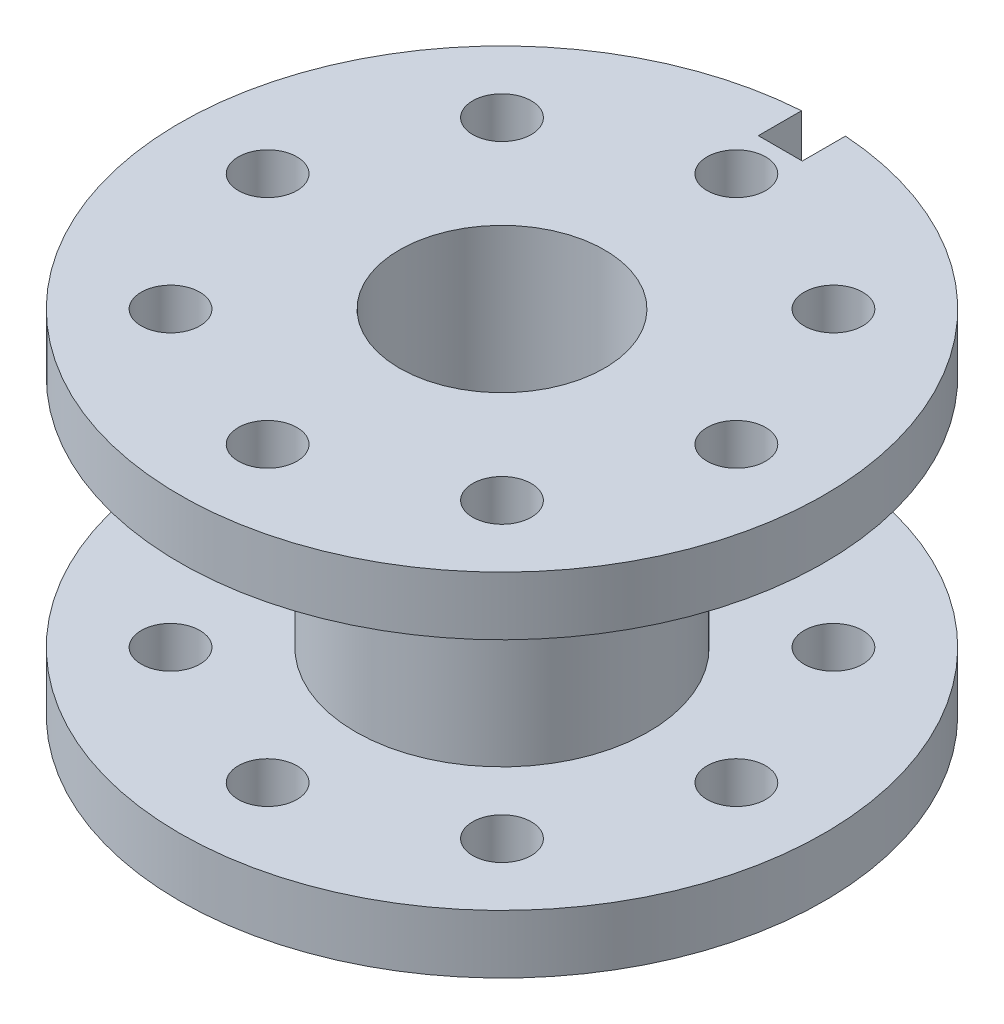
ISO-10303-21;
HEADER;
FILE_DESCRIPTION(('STEP AP214'),'2;1');
FILE_NAME('part.step','',(''),(''),'','','');
FILE_SCHEMA(('AUTOMOTIVE_DESIGN { 1 0 10303 214 1 1 1 1 }'));
ENDSEC;
DATA;
#1=APPLICATION_CONTEXT('core data for automotive mechanical design processes');
#2=APPLICATION_PROTOCOL_DEFINITION('international standard','automotive_design',2000,#1);
#3=PRODUCT_CONTEXT('',#1,'mechanical');
#4=PRODUCT('Part','Part','',(#3));
#5=PRODUCT_RELATED_PRODUCT_CATEGORY('part','',(#4));
#6=PRODUCT_DEFINITION_FORMATION('','',#4);
#7=PRODUCT_DEFINITION_CONTEXT('part definition',#1,'design');
#8=PRODUCT_DEFINITION('design','',#6,#7);
#9=PRODUCT_DEFINITION_SHAPE('','',#8);
#10=(LENGTH_UNIT() NAMED_UNIT(*) SI_UNIT(.MILLI.,.METRE.));
#11=(NAMED_UNIT(*) PLANE_ANGLE_UNIT() SI_UNIT($,.RADIAN.));
#12=(NAMED_UNIT(*) SI_UNIT($,.STERADIAN.) SOLID_ANGLE_UNIT());
#13=UNCERTAINTY_MEASURE_WITH_UNIT(LENGTH_MEASURE(1.E-05),#10,'distance_accuracy_value','');
#14=(GEOMETRIC_REPRESENTATION_CONTEXT(3) GLOBAL_UNCERTAINTY_ASSIGNED_CONTEXT((#13)) GLOBAL_UNIT_ASSIGNED_CONTEXT((#10,
#11,#12)) REPRESENTATION_CONTEXT('',''));
#15=CARTESIAN_POINT('',(0.,0.,0.));
#16=DIRECTION('',(0.,0.,1.));
#17=DIRECTION('',(1.,0.,0.));
#18=AXIS2_PLACEMENT_3D('',#15,#16,#17);
#19=CARTESIAN_POINT('',(0.,12.,0.));
#20=DIRECTION('',(0.,-1.,0.));
#21=DIRECTION('',(0.,0.,-1.));
#22=AXIS2_PLACEMENT_3D('',#19,#20,#21);
#23=CYLINDRICAL_SURFACE('',#22,11.);
#24=CARTESIAN_POINT('',(0.,0.,0.));
#25=DIRECTION('',(0.,1.,0.));
#26=DIRECTION('',(0.,0.,1.));
#27=AXIS2_PLACEMENT_3D('',#24,#25,#26);
#28=CIRCLE('',#27,11.);
#29=CARTESIAN_POINT('',(0.,0.,11.));
#30=VERTEX_POINT('',#29);
#31=EDGE_CURVE('E212',#30,#30,#28,.T.);
#32=ORIENTED_EDGE('',*,*,#31,.T.);
#33=EDGE_LOOP('',(#32));
#34=FACE_BOUND('',#33,.T.);
#35=CARTESIAN_POINT('',(0.,2.,0.));
#36=DIRECTION('',(0.,1.,0.));
#37=DIRECTION('',(0.,0.,1.));
#38=AXIS2_PLACEMENT_3D('',#35,#36,#37);
#39=CIRCLE('',#38,11.);
#40=CARTESIAN_POINT('',(0.,2.,11.));
#41=VERTEX_POINT('',#40);
#42=EDGE_CURVE('E111',#41,#41,#39,.T.);
#43=ORIENTED_EDGE('',*,*,#42,.F.);
#44=EDGE_LOOP('',(#43));
#45=FACE_BOUND('',#44,.T.);
#46=ADVANCED_FACE('F38',(#34,#45),#23,.T.);
#47=CARTESIAN_POINT('',(0.,12.,-8.));
#48=DIRECTION('',(0.,-1.,0.));
#49=DIRECTION('',(0.,0.,-1.));
#50=AXIS2_PLACEMENT_3D('',#47,#48,#49);
#51=CYLINDRICAL_SURFACE('',#50,1.);
#52=CARTESIAN_POINT('',(0.,0.,-8.));
#53=DIRECTION('',(0.,1.,0.));
#54=DIRECTION('',(0.,0.,1.));
#55=AXIS2_PLACEMENT_3D('',#52,#53,#54);
#56=CIRCLE('',#55,1.);
#57=CARTESIAN_POINT('',(0.,0.,-7.));
#58=VERTEX_POINT('',#57);
#59=EDGE_CURVE('E206',#58,#58,#56,.T.);
#60=ORIENTED_EDGE('',*,*,#59,.F.);
#61=EDGE_LOOP('',(#60));
#62=FACE_BOUND('',#61,.T.);
#63=CARTESIAN_POINT('',(0.,2.,-8.));
#64=DIRECTION('',(0.,1.,0.));
#65=DIRECTION('',(0.,0.,1.));
#66=AXIS2_PLACEMENT_3D('',#63,#64,#65);
#67=CIRCLE('',#66,1.);
#68=CARTESIAN_POINT('',(0.,2.,-7.));
#69=VERTEX_POINT('',#68);
#70=EDGE_CURVE('E157',#69,#69,#67,.T.);
#71=ORIENTED_EDGE('',*,*,#70,.T.);
#72=EDGE_LOOP('',(#71));
#73=FACE_BOUND('',#72,.T.);
#74=ADVANCED_FACE('F238',(#62,#73),#51,.F.);
#75=CARTESIAN_POINT('',(5.65685424949272,12.,-5.65685424949252));
#76=DIRECTION('',(0.,-1.,0.));
#77=DIRECTION('',(0.,0.,-1.));
#78=AXIS2_PLACEMENT_3D('',#75,#76,#77);
#79=CYLINDRICAL_SURFACE('',#78,0.99999999999978);
#80=CARTESIAN_POINT('',(5.65685424949272,0.,-5.65685424949252));
#81=DIRECTION('',(0.,1.,0.));
#82=DIRECTION('',(0.,0.,1.));
#83=AXIS2_PLACEMENT_3D('',#80,#81,#82);
#84=CIRCLE('',#83,0.99999999999978);
#85=CARTESIAN_POINT('',(5.65685424949272,0.,-4.65685424949274));
#86=VERTEX_POINT('',#85);
#87=EDGE_CURVE('E200',#86,#86,#84,.T.);
#88=ORIENTED_EDGE('',*,*,#87,.F.);
#89=EDGE_LOOP('',(#88));
#90=FACE_BOUND('',#89,.T.);
#91=CARTESIAN_POINT('',(5.65685424949272,2.,-5.65685424949252));
#92=DIRECTION('',(0.,1.,0.));
#93=DIRECTION('',(0.,0.,1.));
#94=AXIS2_PLACEMENT_3D('',#91,#92,#93);
#95=CIRCLE('',#94,0.99999999999978);
#96=CARTESIAN_POINT('',(5.65685424949272,2.,-4.65685424949274));
#97=VERTEX_POINT('',#96);
#98=EDGE_CURVE('E154',#97,#97,#95,.T.);
#99=ORIENTED_EDGE('',*,*,#98,.T.);
#100=EDGE_LOOP('',(#99));
#101=FACE_BOUND('',#100,.T.);
#102=ADVANCED_FACE('F245',(#90,#101),#79,.F.);
#103=CARTESIAN_POINT('',(8.00000000000068,12.,0.));
#104=DIRECTION('',(0.,-1.,0.));
#105=DIRECTION('',(0.,0.,-1.));
#106=AXIS2_PLACEMENT_3D('',#103,#104,#105);
#107=CYLINDRICAL_SURFACE('',#106,0.999999999999828);
#108=CARTESIAN_POINT('',(8.00000000000068,0.,0.));
#109=DIRECTION('',(0.,1.,0.));
#110=DIRECTION('',(0.,0.,1.));
#111=AXIS2_PLACEMENT_3D('',#108,#109,#110);
#112=CIRCLE('',#111,0.999999999999828);
#113=CARTESIAN_POINT('',(8.00000000000068,0.,0.999999999999828));
#114=VERTEX_POINT('',#113);
#115=EDGE_CURVE('E194',#114,#114,#112,.T.);
#116=ORIENTED_EDGE('',*,*,#115,.F.);
#117=EDGE_LOOP('',(#116));
#118=FACE_BOUND('',#117,.T.);
#119=CARTESIAN_POINT('',(8.00000000000068,2.,0.));
#120=DIRECTION('',(0.,1.,0.));
#121=DIRECTION('',(0.,0.,1.));
#122=AXIS2_PLACEMENT_3D('',#119,#120,#121);
#123=CIRCLE('',#122,0.999999999999828);
#124=CARTESIAN_POINT('',(8.00000000000068,2.,0.999999999999828));
#125=VERTEX_POINT('',#124);
#126=EDGE_CURVE('E151',#125,#125,#123,.T.);
#127=ORIENTED_EDGE('',*,*,#126,.T.);
#128=EDGE_LOOP('',(#127));
#129=FACE_BOUND('',#128,.T.);
#130=ADVANCED_FACE('F299',(#118,#129),#107,.F.);
#131=CARTESIAN_POINT('',(5.6568542494932,12.,5.65685424949272));
#132=DIRECTION('',(0.,-1.,0.));
#133=DIRECTION('',(0.,0.,-1.));
#134=AXIS2_PLACEMENT_3D('',#131,#132,#133);
#135=CYLINDRICAL_SURFACE('',#134,1.00000000000013);
#136=CARTESIAN_POINT('',(5.6568542494932,0.,5.65685424949272));
#137=DIRECTION('',(0.,1.,0.));
#138=DIRECTION('',(0.,0.,1.));
#139=AXIS2_PLACEMENT_3D('',#136,#137,#138);
#140=CIRCLE('',#139,1.00000000000013);
#141=CARTESIAN_POINT('',(5.6568542494932,0.,6.65685424949285));
#142=VERTEX_POINT('',#141);
#143=EDGE_CURVE('E188',#142,#142,#140,.T.);
#144=ORIENTED_EDGE('',*,*,#143,.F.);
#145=EDGE_LOOP('',(#144));
#146=FACE_BOUND('',#145,.T.);
#147=CARTESIAN_POINT('',(5.6568542494932,2.,5.65685424949272));
#148=DIRECTION('',(0.,1.,0.));
#149=DIRECTION('',(0.,0.,1.));
#150=AXIS2_PLACEMENT_3D('',#147,#148,#149);
#151=CIRCLE('',#150,1.00000000000013);
#152=CARTESIAN_POINT('',(5.6568542494932,2.,6.65685424949285));
#153=VERTEX_POINT('',#152);
#154=EDGE_CURVE('E148',#153,#153,#151,.T.);
#155=ORIENTED_EDGE('',*,*,#154,.T.);
#156=EDGE_LOOP('',(#155));
#157=FACE_BOUND('',#156,.T.);
#158=ADVANCED_FACE('F295',(#146,#157),#135,.F.);
#159=CARTESIAN_POINT('',(6.82212565349343E-13,12.,8.00000000000068));
#160=DIRECTION('',(0.,-1.,0.));
#161=DIRECTION('',(0.,0.,-1.));
#162=AXIS2_PLACEMENT_3D('',#159,#160,#161);
#163=CYLINDRICAL_SURFACE('',#162,1.00000000000051);
#164=CARTESIAN_POINT('',(6.82212565349343E-13,0.,8.00000000000068));
#165=DIRECTION('',(0.,1.,0.));
#166=DIRECTION('',(0.,0.,1.));
#167=AXIS2_PLACEMENT_3D('',#164,#165,#166);
#168=CIRCLE('',#167,1.00000000000051);
#169=CARTESIAN_POINT('',(6.82212565349343E-13,0.,9.00000000000119));
#170=VERTEX_POINT('',#169);
#171=EDGE_CURVE('E182',#170,#170,#168,.T.);
#172=ORIENTED_EDGE('',*,*,#171,.F.);
#173=EDGE_LOOP('',(#172));
#174=FACE_BOUND('',#173,.T.);
#175=CARTESIAN_POINT('',(6.82212565349343E-13,2.,8.00000000000068));
#176=DIRECTION('',(0.,1.,0.));
#177=DIRECTION('',(0.,0.,1.));
#178=AXIS2_PLACEMENT_3D('',#175,#176,#177);
#179=CIRCLE('',#178,1.00000000000051);
#180=CARTESIAN_POINT('',(6.82212565349343E-13,2.,9.00000000000119));
#181=VERTEX_POINT('',#180);
#182=EDGE_CURVE('E145',#181,#181,#179,.T.);
#183=ORIENTED_EDGE('',*,*,#182,.T.);
#184=EDGE_LOOP('',(#183));
#185=FACE_BOUND('',#184,.T.);
#186=ADVANCED_FACE('F290',(#174,#185),#163,.F.);
#187=CARTESIAN_POINT('',(-5.65685424949204,12.,5.6568542494932));
#188=DIRECTION('',(0.,-1.,0.));
#189=DIRECTION('',(0.,0.,-1.));
#190=AXIS2_PLACEMENT_3D('',#187,#188,#189);
#191=CYLINDRICAL_SURFACE('',#190,1.00000000000076);
#192=CARTESIAN_POINT('',(-5.65685424949204,0.,5.6568542494932));
#193=DIRECTION('',(0.,1.,0.));
#194=DIRECTION('',(0.,0.,1.));
#195=AXIS2_PLACEMENT_3D('',#192,#193,#194);
#196=CIRCLE('',#195,1.00000000000076);
#197=CARTESIAN_POINT('',(-5.65685424949204,0.,6.65685424949396));
#198=VERTEX_POINT('',#197);
#199=EDGE_CURVE('E176',#198,#198,#196,.T.);
#200=ORIENTED_EDGE('',*,*,#199,.F.);
#201=EDGE_LOOP('',(#200));
#202=FACE_BOUND('',#201,.T.);
#203=CARTESIAN_POINT('',(-5.65685424949204,2.,5.6568542494932));
#204=DIRECTION('',(0.,1.,0.));
#205=DIRECTION('',(0.,0.,1.));
#206=AXIS2_PLACEMENT_3D('',#203,#204,#205);
#207=CIRCLE('',#206,1.00000000000076);
#208=CARTESIAN_POINT('',(-5.65685424949204,2.,6.65685424949396));
#209=VERTEX_POINT('',#208);
#210=EDGE_CURVE('E142',#209,#209,#207,.T.);
#211=ORIENTED_EDGE('',*,*,#210,.T.);
#212=EDGE_LOOP('',(#211));
#213=FACE_BOUND('',#212,.T.);
#214=ADVANCED_FACE('F285',(#202,#213),#191,.F.);
#215=CARTESIAN_POINT('',(-8.,12.,6.82091801405444E-13));
#216=DIRECTION('',(0.,-1.,0.));
#217=DIRECTION('',(0.,0.,-1.));
#218=AXIS2_PLACEMENT_3D('',#215,#216,#217);
#219=CYLINDRICAL_SURFACE('',#218,1.00000000000073);
#220=CARTESIAN_POINT('',(-8.,0.,6.82091801405444E-13));
#221=DIRECTION('',(0.,1.,0.));
#222=DIRECTION('',(0.,0.,1.));
#223=AXIS2_PLACEMENT_3D('',#220,#221,#222);
#224=CIRCLE('',#223,1.00000000000073);
#225=CARTESIAN_POINT('',(-8.,0.,1.00000000000141));
#226=VERTEX_POINT('',#225);
#227=EDGE_CURVE('E170',#226,#226,#224,.T.);
#228=ORIENTED_EDGE('',*,*,#227,.F.);
#229=EDGE_LOOP('',(#228));
#230=FACE_BOUND('',#229,.T.);
#231=CARTESIAN_POINT('',(-8.,2.,6.82091801405444E-13));
#232=DIRECTION('',(0.,1.,0.));
#233=DIRECTION('',(0.,0.,1.));
#234=AXIS2_PLACEMENT_3D('',#231,#232,#233);
#235=CIRCLE('',#234,1.00000000000073);
#236=CARTESIAN_POINT('',(-8.,2.,1.00000000000141));
#237=VERTEX_POINT('',#236);
#238=EDGE_CURVE('E139',#237,#237,#235,.T.);
#239=ORIENTED_EDGE('',*,*,#238,.T.);
#240=EDGE_LOOP('',(#239));
#241=FACE_BOUND('',#240,.T.);
#242=ADVANCED_FACE('F280',(#230,#241),#219,.F.);
#243=CARTESIAN_POINT('',(-5.65685424949252,12.,-5.65685424949204));
#244=DIRECTION('',(0.,-1.,0.));
#245=DIRECTION('',(0.,0.,-1.));
#246=AXIS2_PLACEMENT_3D('',#243,#244,#245);
#247=CYLINDRICAL_SURFACE('',#246,1.00000000000046);
#248=CARTESIAN_POINT('',(-5.65685424949252,0.,-5.65685424949204));
#249=DIRECTION('',(0.,1.,0.));
#250=DIRECTION('',(0.,0.,1.));
#251=AXIS2_PLACEMENT_3D('',#248,#249,#250);
#252=CIRCLE('',#251,1.00000000000046);
#253=CARTESIAN_POINT('',(-5.65685424949252,0.,-4.65685424949158));
#254=VERTEX_POINT('',#253);
#255=EDGE_CURVE('E164',#254,#254,#252,.T.);
#256=ORIENTED_EDGE('',*,*,#255,.F.);
#257=EDGE_LOOP('',(#256));
#258=FACE_BOUND('',#257,.T.);
#259=CARTESIAN_POINT('',(-5.65685424949252,2.,-5.65685424949204));
#260=DIRECTION('',(0.,1.,0.));
#261=DIRECTION('',(0.,0.,1.));
#262=AXIS2_PLACEMENT_3D('',#259,#260,#261);
#263=CIRCLE('',#262,1.00000000000046);
#264=CARTESIAN_POINT('',(-5.65685424949252,2.,-4.65685424949158));
#265=VERTEX_POINT('',#264);
#266=EDGE_CURVE('E138',#265,#265,#263,.T.);
#267=ORIENTED_EDGE('',*,*,#266,.T.);
#268=EDGE_LOOP('',(#267));
#269=FACE_BOUND('',#268,.T.);
#270=ADVANCED_FACE('F275',(#258,#269),#247,.F.);
#271=CARTESIAN_POINT('',(0.,12.,0.));
#272=DIRECTION('',(0.,1.,0.));
#273=DIRECTION('',(0.,0.,1.));
#274=AXIS2_PLACEMENT_3D('',#271,#272,#273);
#275=PLANE('',#274);
#276=DIRECTION('',(0.,0.,-1.));
#277=VECTOR('',#276,1.);
#278=CARTESIAN_POINT('',(0.749999999999999,12.,-12.5));
#279=LINE('',#278,#277);
#280=CARTESIAN_POINT('',(0.75,12.,-9.5));
#281=VERTEX_POINT('',#280);
#282=CARTESIAN_POINT('',(0.75,12.,-10.974402033824));
#283=VERTEX_POINT('',#282);
#284=EDGE_CURVE('E94',#281,#283,#279,.T.);
#285=ORIENTED_EDGE('',*,*,#284,.F.);
#286=DIRECTION('',(1.,0.,0.));
#287=VECTOR('',#286,1.);
#288=CARTESIAN_POINT('',(-0.75,12.,-9.5));
#289=LINE('',#288,#287);
#290=CARTESIAN_POINT('',(-0.75,12.,-9.5));
#291=VERTEX_POINT('',#290);
#292=EDGE_CURVE('E80',#291,#281,#289,.T.);
#293=ORIENTED_EDGE('',*,*,#292,.F.);
#294=DIRECTION('',(0.,0.,1.));
#295=VECTOR('',#294,1.);
#296=CARTESIAN_POINT('',(-0.750000000000001,12.,-12.5));
#297=LINE('',#296,#295);
#298=CARTESIAN_POINT('',(-0.75,12.,-10.974402033824));
#299=VERTEX_POINT('',#298);
#300=EDGE_CURVE('E87',#299,#291,#297,.T.);
#301=ORIENTED_EDGE('',*,*,#300,.F.);
#302=CARTESIAN_POINT('',(0.,12.,0.));
#303=DIRECTION('',(0.,1.,0.));
#304=DIRECTION('',(0.,0.,1.));
#305=AXIS2_PLACEMENT_3D('',#302,#303,#304);
#306=CIRCLE('',#305,11.);
#307=EDGE_CURVE('E215',#299,#283,#306,.T.);
#308=ORIENTED_EDGE('',*,*,#307,.T.);
#309=EDGE_LOOP('',(#285,#293,#301,#308));
#310=FACE_BOUND('',#309,.T.);
#311=CARTESIAN_POINT('',(0.,12.,0.));
#312=DIRECTION('',(0.,1.,0.));
#313=DIRECTION('',(0.,0.,1.));
#314=AXIS2_PLACEMENT_3D('',#311,#312,#313);
#315=CIRCLE('',#314,3.5);
#316=CARTESIAN_POINT('',(0.,12.,3.5));
#317=VERTEX_POINT('',#316);
#318=EDGE_CURVE('E160',#317,#317,#315,.T.);
#319=ORIENTED_EDGE('',*,*,#318,.F.);
#320=EDGE_LOOP('',(#319));
#321=FACE_BOUND('',#320,.T.);
#322=CARTESIAN_POINT('',(-8.,12.,6.82091801405444E-13));
#323=DIRECTION('',(0.,1.,0.));
#324=DIRECTION('',(0.,0.,1.));
#325=AXIS2_PLACEMENT_3D('',#322,#323,#324);
#326=CIRCLE('',#325,1.00000000000073);
#327=CARTESIAN_POINT('',(-8.,12.,1.00000000000141));
#328=VERTEX_POINT('',#327);
#329=EDGE_CURVE('E173',#328,#328,#326,.T.);
#330=ORIENTED_EDGE('',*,*,#329,.F.);
#331=EDGE_LOOP('',(#330));
#332=FACE_BOUND('',#331,.T.);
#333=CARTESIAN_POINT('',(6.82212565349343E-13,12.,8.00000000000068));
#334=DIRECTION('',(0.,1.,0.));
#335=DIRECTION('',(0.,0.,1.));
#336=AXIS2_PLACEMENT_3D('',#333,#334,#335);
#337=CIRCLE('',#336,1.00000000000051);
#338=CARTESIAN_POINT('',(6.82212565349343E-13,12.,9.00000000000119));
#339=VERTEX_POINT('',#338);
#340=EDGE_CURVE('E185',#339,#339,#337,.T.);
#341=ORIENTED_EDGE('',*,*,#340,.F.);
#342=EDGE_LOOP('',(#341));
#343=FACE_BOUND('',#342,.T.);
#344=CARTESIAN_POINT('',(8.00000000000068,12.,0.));
#345=DIRECTION('',(0.,1.,0.));
#346=DIRECTION('',(0.,0.,1.));
#347=AXIS2_PLACEMENT_3D('',#344,#345,#346);
#348=CIRCLE('',#347,0.999999999999828);
#349=CARTESIAN_POINT('',(8.00000000000068,12.,0.999999999999828));
#350=VERTEX_POINT('',#349);
#351=EDGE_CURVE('E197',#350,#350,#348,.T.);
#352=ORIENTED_EDGE('',*,*,#351,.F.);
#353=EDGE_LOOP('',(#352));
#354=FACE_BOUND('',#353,.T.);
#355=CARTESIAN_POINT('',(0.,12.,-8.));
#356=DIRECTION('',(0.,1.,0.));
#357=DIRECTION('',(0.,0.,1.));
#358=AXIS2_PLACEMENT_3D('',#355,#356,#357);
#359=CIRCLE('',#358,1.);
#360=CARTESIAN_POINT('',(0.,12.,-7.));
#361=VERTEX_POINT('',#360);
#362=EDGE_CURVE('E209',#361,#361,#359,.T.);
#363=ORIENTED_EDGE('',*,*,#362,.F.);
#364=EDGE_LOOP('',(#363));
#365=FACE_BOUND('',#364,.T.);
#366=CARTESIAN_POINT('',(5.65685424949272,12.,-5.65685424949252));
#367=DIRECTION('',(0.,1.,0.));
#368=DIRECTION('',(0.,0.,1.));
#369=AXIS2_PLACEMENT_3D('',#366,#367,#368);
#370=CIRCLE('',#369,0.99999999999978);
#371=CARTESIAN_POINT('',(5.65685424949272,12.,-4.65685424949274));
#372=VERTEX_POINT('',#371);
#373=EDGE_CURVE('E203',#372,#372,#370,.T.);
#374=ORIENTED_EDGE('',*,*,#373,.F.);
#375=EDGE_LOOP('',(#374));
#376=FACE_BOUND('',#375,.T.);
#377=CARTESIAN_POINT('',(5.6568542494932,12.,5.65685424949272));
#378=DIRECTION('',(0.,1.,0.));
#379=DIRECTION('',(0.,0.,1.));
#380=AXIS2_PLACEMENT_3D('',#377,#378,#379);
#381=CIRCLE('',#380,1.00000000000013);
#382=CARTESIAN_POINT('',(5.6568542494932,12.,6.65685424949285));
#383=VERTEX_POINT('',#382);
#384=EDGE_CURVE('E191',#383,#383,#381,.T.);
#385=ORIENTED_EDGE('',*,*,#384,.F.);
#386=EDGE_LOOP('',(#385));
#387=FACE_BOUND('',#386,.T.);
#388=CARTESIAN_POINT('',(-5.65685424949204,12.,5.6568542494932));
#389=DIRECTION('',(0.,1.,0.));
#390=DIRECTION('',(0.,0.,1.));
#391=AXIS2_PLACEMENT_3D('',#388,#389,#390);
#392=CIRCLE('',#391,1.00000000000076);
#393=CARTESIAN_POINT('',(-5.65685424949204,12.,6.65685424949396));
#394=VERTEX_POINT('',#393);
#395=EDGE_CURVE('E179',#394,#394,#392,.T.);
#396=ORIENTED_EDGE('',*,*,#395,.F.);
#397=EDGE_LOOP('',(#396));
#398=FACE_BOUND('',#397,.T.);
#399=CARTESIAN_POINT('',(-5.65685424949252,12.,-5.65685424949204));
#400=DIRECTION('',(0.,1.,0.));
#401=DIRECTION('',(0.,0.,1.));
#402=AXIS2_PLACEMENT_3D('',#399,#400,#401);
#403=CIRCLE('',#402,1.00000000000046);
#404=CARTESIAN_POINT('',(-5.65685424949252,12.,-4.65685424949158));
#405=VERTEX_POINT('',#404);
#406=EDGE_CURVE('E167',#405,#405,#403,.T.);
#407=ORIENTED_EDGE('',*,*,#406,.F.);
#408=EDGE_LOOP('',(#407));
#409=FACE_BOUND('',#408,.T.);
#410=ADVANCED_FACE('F96',(#310,#321,#332,#343,#354,#365,#376,#387,#398,#409),#275,.T.);
#411=CARTESIAN_POINT('',(0.,0.,0.));
#412=DIRECTION('',(0.,1.,0.));
#413=DIRECTION('',(0.,0.,1.));
#414=AXIS2_PLACEMENT_3D('',#411,#412,#413);
#415=PLANE('',#414);
#416=CARTESIAN_POINT('',(0.,0.,0.));
#417=DIRECTION('',(0.,1.,0.));
#418=DIRECTION('',(0.,0.,1.));
#419=AXIS2_PLACEMENT_3D('',#416,#417,#418);
#420=CIRCLE('',#419,3.5);
#421=CARTESIAN_POINT('',(0.,0.,3.5));
#422=VERTEX_POINT('',#421);
#423=EDGE_CURVE('E161',#422,#422,#420,.T.);
#424=ORIENTED_EDGE('',*,*,#423,.T.);
#425=EDGE_LOOP('',(#424));
#426=FACE_BOUND('',#425,.T.);
#427=ORIENTED_EDGE('',*,*,#31,.F.);
#428=EDGE_LOOP('',(#427));
#429=FACE_BOUND('',#428,.T.);
#430=ORIENTED_EDGE('',*,*,#59,.T.);
#431=EDGE_LOOP('',(#430));
#432=FACE_BOUND('',#431,.T.);
#433=ORIENTED_EDGE('',*,*,#87,.T.);
#434=EDGE_LOOP('',(#433));
#435=FACE_BOUND('',#434,.T.);
#436=ORIENTED_EDGE('',*,*,#115,.T.);
#437=EDGE_LOOP('',(#436));
#438=FACE_BOUND('',#437,.T.);
#439=ORIENTED_EDGE('',*,*,#143,.T.);
#440=EDGE_LOOP('',(#439));
#441=FACE_BOUND('',#440,.T.);
#442=ORIENTED_EDGE('',*,*,#171,.T.);
#443=EDGE_LOOP('',(#442));
#444=FACE_BOUND('',#443,.T.);
#445=ORIENTED_EDGE('',*,*,#199,.T.);
#446=EDGE_LOOP('',(#445));
#447=FACE_BOUND('',#446,.T.);
#448=ORIENTED_EDGE('',*,*,#227,.T.);
#449=EDGE_LOOP('',(#448));
#450=FACE_BOUND('',#449,.T.);
#451=ORIENTED_EDGE('',*,*,#255,.T.);
#452=EDGE_LOOP('',(#451));
#453=FACE_BOUND('',#452,.T.);
#454=ADVANCED_FACE('F230',(#426,#429,#432,#435,#438,#441,#444,#447,#450,#453),#415,.F.);
#455=CARTESIAN_POINT('',(0.,10.,0.));
#456=DIRECTION('',(0.,1.,0.));
#457=DIRECTION('',(0.,0.,1.));
#458=AXIS2_PLACEMENT_3D('',#455,#456,#457);
#459=CIRCLE('',#458,11.);
#460=CARTESIAN_POINT('',(-0.75,10.,-10.974402033824));
#461=VERTEX_POINT('',#460);
#462=CARTESIAN_POINT('',(0.75,10.,-10.974402033824));
#463=VERTEX_POINT('',#462);
#464=EDGE_CURVE('E108',#461,#463,#459,.T.);
#465=ORIENTED_EDGE('',*,*,#464,.T.);
#466=DIRECTION('',(0.,-1.,0.));
#467=VECTOR('',#466,1.);
#468=CARTESIAN_POINT('',(0.75,12.,-10.974402033824));
#469=LINE('',#468,#467);
#470=EDGE_CURVE('E61',#463,#283,#469,.F.);
#471=ORIENTED_EDGE('',*,*,#470,.T.);
#472=ORIENTED_EDGE('',*,*,#307,.F.);
#473=DIRECTION('',(0.,-1.,0.));
#474=VECTOR('',#473,1.);
#475=CARTESIAN_POINT('',(-0.75,12.,-10.974402033824));
#476=LINE('',#475,#474);
#477=EDGE_CURVE('E90',#299,#461,#476,.T.);
#478=ORIENTED_EDGE('',*,*,#477,.T.);
#479=EDGE_LOOP('',(#465,#471,#472,#478));
#480=FACE_BOUND('',#479,.T.);
#481=ADVANCED_FACE('F40',(#480),#23,.T.);
#482=CARTESIAN_POINT('',(0.,10.,-8.));
#483=DIRECTION('',(0.,1.,0.));
#484=DIRECTION('',(0.,0.,1.));
#485=AXIS2_PLACEMENT_3D('',#482,#483,#484);
#486=CIRCLE('',#485,1.);
#487=CARTESIAN_POINT('',(0.,10.,-7.));
#488=VERTEX_POINT('',#487);
#489=EDGE_CURVE('E135',#488,#488,#486,.T.);
#490=ORIENTED_EDGE('',*,*,#489,.F.);
#491=EDGE_LOOP('',(#490));
#492=FACE_BOUND('',#491,.T.);
#493=ORIENTED_EDGE('',*,*,#362,.T.);
#494=EDGE_LOOP('',(#493));
#495=FACE_BOUND('',#494,.T.);
#496=ADVANCED_FACE('F229',(#492,#495),#51,.F.);
#497=CARTESIAN_POINT('',(5.65685424949272,10.,-5.65685424949252));
#498=DIRECTION('',(0.,1.,0.));
#499=DIRECTION('',(0.,0.,1.));
#500=AXIS2_PLACEMENT_3D('',#497,#498,#499);
#501=CIRCLE('',#500,0.99999999999978);
#502=CARTESIAN_POINT('',(5.65685424949272,10.,-4.65685424949274));
#503=VERTEX_POINT('',#502);
#504=EDGE_CURVE('E132',#503,#503,#501,.T.);
#505=ORIENTED_EDGE('',*,*,#504,.F.);
#506=EDGE_LOOP('',(#505));
#507=FACE_BOUND('',#506,.T.);
#508=ORIENTED_EDGE('',*,*,#373,.T.);
#509=EDGE_LOOP('',(#508));
#510=FACE_BOUND('',#509,.T.);
#511=ADVANCED_FACE('F235',(#507,#510),#79,.F.);
#512=CARTESIAN_POINT('',(8.00000000000068,10.,0.));
#513=DIRECTION('',(0.,1.,0.));
#514=DIRECTION('',(0.,0.,1.));
#515=AXIS2_PLACEMENT_3D('',#512,#513,#514);
#516=CIRCLE('',#515,0.999999999999828);
#517=CARTESIAN_POINT('',(8.00000000000068,10.,0.999999999999828));
#518=VERTEX_POINT('',#517);
#519=EDGE_CURVE('E129',#518,#518,#516,.T.);
#520=ORIENTED_EDGE('',*,*,#519,.F.);
#521=EDGE_LOOP('',(#520));
#522=FACE_BOUND('',#521,.T.);
#523=ORIENTED_EDGE('',*,*,#351,.T.);
#524=EDGE_LOOP('',(#523));
#525=FACE_BOUND('',#524,.T.);
#526=ADVANCED_FACE('F293',(#522,#525),#107,.F.);
#527=CARTESIAN_POINT('',(5.6568542494932,10.,5.65685424949272));
#528=DIRECTION('',(0.,1.,0.));
#529=DIRECTION('',(0.,0.,1.));
#530=AXIS2_PLACEMENT_3D('',#527,#528,#529);
#531=CIRCLE('',#530,1.00000000000013);
#532=CARTESIAN_POINT('',(5.6568542494932,10.,6.65685424949285));
#533=VERTEX_POINT('',#532);
#534=EDGE_CURVE('E126',#533,#533,#531,.T.);
#535=ORIENTED_EDGE('',*,*,#534,.F.);
#536=EDGE_LOOP('',(#535));
#537=FACE_BOUND('',#536,.T.);
#538=ORIENTED_EDGE('',*,*,#384,.T.);
#539=EDGE_LOOP('',(#538));
#540=FACE_BOUND('',#539,.T.);
#541=ADVANCED_FACE('F288',(#537,#540),#135,.F.);
#542=CARTESIAN_POINT('',(6.82212565349343E-13,10.,8.00000000000068));
#543=DIRECTION('',(0.,1.,0.));
#544=DIRECTION('',(0.,0.,1.));
#545=AXIS2_PLACEMENT_3D('',#542,#543,#544);
#546=CIRCLE('',#545,1.00000000000051);
#547=CARTESIAN_POINT('',(6.82212565349343E-13,10.,9.00000000000119));
#548=VERTEX_POINT('',#547);
#549=EDGE_CURVE('E123',#548,#548,#546,.T.);
#550=ORIENTED_EDGE('',*,*,#549,.F.);
#551=EDGE_LOOP('',(#550));
#552=FACE_BOUND('',#551,.T.);
#553=ORIENTED_EDGE('',*,*,#340,.T.);
#554=EDGE_LOOP('',(#553));
#555=FACE_BOUND('',#554,.T.);
#556=ADVANCED_FACE('F283',(#552,#555),#163,.F.);
#557=CARTESIAN_POINT('',(-5.65685424949204,10.,5.6568542494932));
#558=DIRECTION('',(0.,1.,0.));
#559=DIRECTION('',(0.,0.,1.));
#560=AXIS2_PLACEMENT_3D('',#557,#558,#559);
#561=CIRCLE('',#560,1.00000000000076);
#562=CARTESIAN_POINT('',(-5.65685424949204,10.,6.65685424949396));
#563=VERTEX_POINT('',#562);
#564=EDGE_CURVE('E120',#563,#563,#561,.T.);
#565=ORIENTED_EDGE('',*,*,#564,.F.);
#566=EDGE_LOOP('',(#565));
#567=FACE_BOUND('',#566,.T.);
#568=ORIENTED_EDGE('',*,*,#395,.T.);
#569=EDGE_LOOP('',(#568));
#570=FACE_BOUND('',#569,.T.);
#571=ADVANCED_FACE('F278',(#567,#570),#191,.F.);
#572=CARTESIAN_POINT('',(-8.,10.,6.82091801405444E-13));
#573=DIRECTION('',(0.,1.,0.));
#574=DIRECTION('',(0.,0.,1.));
#575=AXIS2_PLACEMENT_3D('',#572,#573,#574);
#576=CIRCLE('',#575,1.00000000000073);
#577=CARTESIAN_POINT('',(-8.,10.,1.00000000000141));
#578=VERTEX_POINT('',#577);
#579=EDGE_CURVE('E117',#578,#578,#576,.T.);
#580=ORIENTED_EDGE('',*,*,#579,.F.);
#581=EDGE_LOOP('',(#580));
#582=FACE_BOUND('',#581,.T.);
#583=ORIENTED_EDGE('',*,*,#329,.T.);
#584=EDGE_LOOP('',(#583));
#585=FACE_BOUND('',#584,.T.);
#586=ADVANCED_FACE('F273',(#582,#585),#219,.F.);
#587=CARTESIAN_POINT('',(-5.65685424949252,10.,-5.65685424949204));
#588=DIRECTION('',(0.,1.,0.));
#589=DIRECTION('',(0.,0.,1.));
#590=AXIS2_PLACEMENT_3D('',#587,#588,#589);
#591=CIRCLE('',#590,1.00000000000046);
#592=CARTESIAN_POINT('',(-5.65685424949252,10.,-4.65685424949158));
#593=VERTEX_POINT('',#592);
#594=EDGE_CURVE('E114',#593,#593,#591,.T.);
#595=ORIENTED_EDGE('',*,*,#594,.F.);
#596=EDGE_LOOP('',(#595));
#597=FACE_BOUND('',#596,.T.);
#598=ORIENTED_EDGE('',*,*,#406,.T.);
#599=EDGE_LOOP('',(#598));
#600=FACE_BOUND('',#599,.T.);
#601=ADVANCED_FACE('F263',(#597,#600),#247,.F.);
#602=CARTESIAN_POINT('',(0.,0.,0.));
#603=DIRECTION('',(0.,1.,0.));
#604=DIRECTION('',(0.,0.,1.));
#605=AXIS2_PLACEMENT_3D('',#602,#603,#604);
#606=CYLINDRICAL_SURFACE('',#605,3.5);
#607=ORIENTED_EDGE('',*,*,#423,.F.);
#608=EDGE_LOOP('',(#607));
#609=FACE_BOUND('',#608,.T.);
#610=ORIENTED_EDGE('',*,*,#318,.T.);
#611=EDGE_LOOP('',(#610));
#612=FACE_BOUND('',#611,.T.);
#613=ADVANCED_FACE('F253',(#609,#612),#606,.F.);
#614=CARTESIAN_POINT('',(0.,2.,0.));
#615=DIRECTION('',(0.,1.,0.));
#616=DIRECTION('',(0.,0.,1.));
#617=AXIS2_PLACEMENT_3D('',#614,#615,#616);
#618=PLANE('',#617);
#619=ORIENTED_EDGE('',*,*,#70,.F.);
#620=EDGE_LOOP('',(#619));
#621=FACE_BOUND('',#620,.T.);
#622=ORIENTED_EDGE('',*,*,#98,.F.);
#623=EDGE_LOOP('',(#622));
#624=FACE_BOUND('',#623,.T.);
#625=ORIENTED_EDGE('',*,*,#126,.F.);
#626=EDGE_LOOP('',(#625));
#627=FACE_BOUND('',#626,.T.);
#628=ORIENTED_EDGE('',*,*,#154,.F.);
#629=EDGE_LOOP('',(#628));
#630=FACE_BOUND('',#629,.T.);
#631=ORIENTED_EDGE('',*,*,#182,.F.);
#632=EDGE_LOOP('',(#631));
#633=FACE_BOUND('',#632,.T.);
#634=ORIENTED_EDGE('',*,*,#210,.F.);
#635=EDGE_LOOP('',(#634));
#636=FACE_BOUND('',#635,.T.);
#637=ORIENTED_EDGE('',*,*,#238,.F.);
#638=EDGE_LOOP('',(#637));
#639=FACE_BOUND('',#638,.T.);
#640=ORIENTED_EDGE('',*,*,#266,.F.);
#641=EDGE_LOOP('',(#640));
#642=FACE_BOUND('',#641,.T.);
#643=CARTESIAN_POINT('',(0.,2.,0.));
#644=DIRECTION('',(0.,1.,0.));
#645=DIRECTION('',(0.,0.,1.));
#646=AXIS2_PLACEMENT_3D('',#643,#644,#645);
#647=CIRCLE('',#646,5.);
#648=CARTESIAN_POINT('',(0.,2.,5.));
#649=VERTEX_POINT('',#648);
#650=EDGE_CURVE('E105',#649,#649,#647,.T.);
#651=ORIENTED_EDGE('',*,*,#650,.F.);
#652=EDGE_LOOP('',(#651));
#653=FACE_BOUND('',#652,.T.);
#654=ORIENTED_EDGE('',*,*,#42,.T.);
#655=EDGE_LOOP('',(#654));
#656=FACE_BOUND('',#655,.T.);
#657=ADVANCED_FACE('F251',(#621,#624,#627,#630,#633,#636,#639,#642,#653,#656),#618,.T.);
#658=CARTESIAN_POINT('',(0.,10.,0.));
#659=DIRECTION('',(0.,1.,0.));
#660=DIRECTION('',(0.,0.,1.));
#661=AXIS2_PLACEMENT_3D('',#658,#659,#660);
#662=PLANE('',#661);
#663=ORIENTED_EDGE('',*,*,#489,.T.);
#664=EDGE_LOOP('',(#663));
#665=FACE_BOUND('',#664,.T.);
#666=ORIENTED_EDGE('',*,*,#504,.T.);
#667=EDGE_LOOP('',(#666));
#668=FACE_BOUND('',#667,.T.);
#669=ORIENTED_EDGE('',*,*,#519,.T.);
#670=EDGE_LOOP('',(#669));
#671=FACE_BOUND('',#670,.T.);
#672=ORIENTED_EDGE('',*,*,#534,.T.);
#673=EDGE_LOOP('',(#672));
#674=FACE_BOUND('',#673,.T.);
#675=ORIENTED_EDGE('',*,*,#549,.T.);
#676=EDGE_LOOP('',(#675));
#677=FACE_BOUND('',#676,.T.);
#678=ORIENTED_EDGE('',*,*,#564,.T.);
#679=EDGE_LOOP('',(#678));
#680=FACE_BOUND('',#679,.T.);
#681=ORIENTED_EDGE('',*,*,#579,.T.);
#682=EDGE_LOOP('',(#681));
#683=FACE_BOUND('',#682,.T.);
#684=ORIENTED_EDGE('',*,*,#594,.T.);
#685=EDGE_LOOP('',(#684));
#686=FACE_BOUND('',#685,.T.);
#687=CARTESIAN_POINT('',(0.,10.,0.));
#688=DIRECTION('',(0.,1.,0.));
#689=DIRECTION('',(0.,0.,1.));
#690=AXIS2_PLACEMENT_3D('',#687,#688,#689);
#691=CIRCLE('',#690,5.);
#692=CARTESIAN_POINT('',(0.,10.,5.));
#693=VERTEX_POINT('',#692);
#694=EDGE_CURVE('E104',#693,#693,#691,.T.);
#695=ORIENTED_EDGE('',*,*,#694,.T.);
#696=EDGE_LOOP('',(#695));
#697=FACE_BOUND('',#696,.T.);
#698=DIRECTION('',(1.,0.,0.));
#699=VECTOR('',#698,1.);
#700=CARTESIAN_POINT('',(0.,10.,-9.5));
#701=LINE('',#700,#699);
#702=CARTESIAN_POINT('',(-0.75,10.,-9.5));
#703=VERTEX_POINT('',#702);
#704=CARTESIAN_POINT('',(0.75,10.,-9.5));
#705=VERTEX_POINT('',#704);
#706=EDGE_CURVE('E46',#703,#705,#701,.T.);
#707=ORIENTED_EDGE('',*,*,#706,.T.);
#708=DIRECTION('',(0.,0.,-1.));
#709=VECTOR('',#708,1.);
#710=CARTESIAN_POINT('',(0.750000000000001,10.,0.));
#711=LINE('',#710,#709);
#712=EDGE_CURVE('E11',#705,#463,#711,.T.);
#713=ORIENTED_EDGE('',*,*,#712,.T.);
#714=ORIENTED_EDGE('',*,*,#464,.F.);
#715=DIRECTION('',(0.,0.,1.));
#716=VECTOR('',#715,1.);
#717=CARTESIAN_POINT('',(-0.749999999999999,10.,0.));
#718=LINE('',#717,#716);
#719=EDGE_CURVE('E217',#461,#703,#718,.T.);
#720=ORIENTED_EDGE('',*,*,#719,.T.);
#721=EDGE_LOOP('',(#707,#713,#714,#720));
#722=FACE_BOUND('',#721,.T.);
#723=ADVANCED_FACE('F225',(#665,#668,#671,#674,#677,#680,#683,#686,#697,#722),#662,.F.);
#724=CARTESIAN_POINT('',(0.,2.,0.));
#725=DIRECTION('',(0.,1.,0.));
#726=DIRECTION('',(0.,0.,1.));
#727=AXIS2_PLACEMENT_3D('',#724,#725,#726);
#728=CYLINDRICAL_SURFACE('',#727,5.);
#729=ORIENTED_EDGE('',*,*,#650,.T.);
#730=EDGE_LOOP('',(#729));
#731=FACE_BOUND('',#730,.T.);
#732=ORIENTED_EDGE('',*,*,#694,.F.);
#733=EDGE_LOOP('',(#732));
#734=FACE_BOUND('',#733,.T.);
#735=ADVANCED_FACE('F260',(#731,#734),#728,.T.);
#736=CARTESIAN_POINT('',(0.749999999999999,8.,-12.5));
#737=DIRECTION('',(1.,0.,0.));
#738=DIRECTION('',(0.,0.,-1.));
#739=AXIS2_PLACEMENT_3D('',#736,#737,#738);
#740=PLANE('',#739);
#741=ORIENTED_EDGE('',*,*,#712,.F.);
#742=DIRECTION('',(0.,1.,0.));
#743=VECTOR('',#742,1.);
#744=CARTESIAN_POINT('',(0.75,8.,-9.5));
#745=LINE('',#744,#743);
#746=EDGE_CURVE('E84',#705,#281,#745,.T.);
#747=ORIENTED_EDGE('',*,*,#746,.T.);
#748=ORIENTED_EDGE('',*,*,#284,.T.);
#749=ORIENTED_EDGE('',*,*,#470,.F.);
#750=EDGE_LOOP('',(#741,#747,#748,#749));
#751=FACE_BOUND('',#750,.T.);
#752=ADVANCED_FACE('F321',(#751),#740,.F.);
#753=CARTESIAN_POINT('',(-0.75,8.,-9.5));
#754=DIRECTION('',(0.,0.,1.));
#755=DIRECTION('',(1.,0.,0.));
#756=AXIS2_PLACEMENT_3D('',#753,#754,#755);
#757=PLANE('',#756);
#758=DIRECTION('',(0.,1.,0.));
#759=VECTOR('',#758,1.);
#760=CARTESIAN_POINT('',(-0.75,8.,-9.5));
#761=LINE('',#760,#759);
#762=EDGE_CURVE('E53',#703,#291,#761,.T.);
#763=ORIENTED_EDGE('',*,*,#762,.T.);
#764=ORIENTED_EDGE('',*,*,#292,.T.);
#765=ORIENTED_EDGE('',*,*,#746,.F.);
#766=ORIENTED_EDGE('',*,*,#706,.F.);
#767=EDGE_LOOP('',(#763,#764,#765,#766));
#768=FACE_BOUND('',#767,.T.);
#769=ADVANCED_FACE('F77',(#768),#757,.F.);
#770=CARTESIAN_POINT('',(-0.750000000000001,8.,-12.5));
#771=DIRECTION('',(-1.,0.,0.));
#772=DIRECTION('',(0.,0.,1.));
#773=AXIS2_PLACEMENT_3D('',#770,#771,#772);
#774=PLANE('',#773);
#775=ORIENTED_EDGE('',*,*,#300,.T.);
#776=ORIENTED_EDGE('',*,*,#762,.F.);
#777=ORIENTED_EDGE('',*,*,#719,.F.);
#778=ORIENTED_EDGE('',*,*,#477,.F.);
#779=EDGE_LOOP('',(#775,#776,#777,#778));
#780=FACE_BOUND('',#779,.T.);
#781=ADVANCED_FACE('F88',(#780),#774,.F.);
#782=CLOSED_SHELL('',(#46,#74,#102,#130,#158,#186,#214,#242,#270,#410,#454,#481,#496,#511,#526,
#541,#556,#571,#586,#601,#613,#657,#723,#735,#752,#769,#781));
#783=MANIFOLD_SOLID_BREP('B2',#782);
#784=ADVANCED_BREP_SHAPE_REPRESENTATION('',(#18,#783),#14);
#785=SHAPE_DEFINITION_REPRESENTATION(#9,#784);
ENDSEC;
END-ISO-10303-21;
